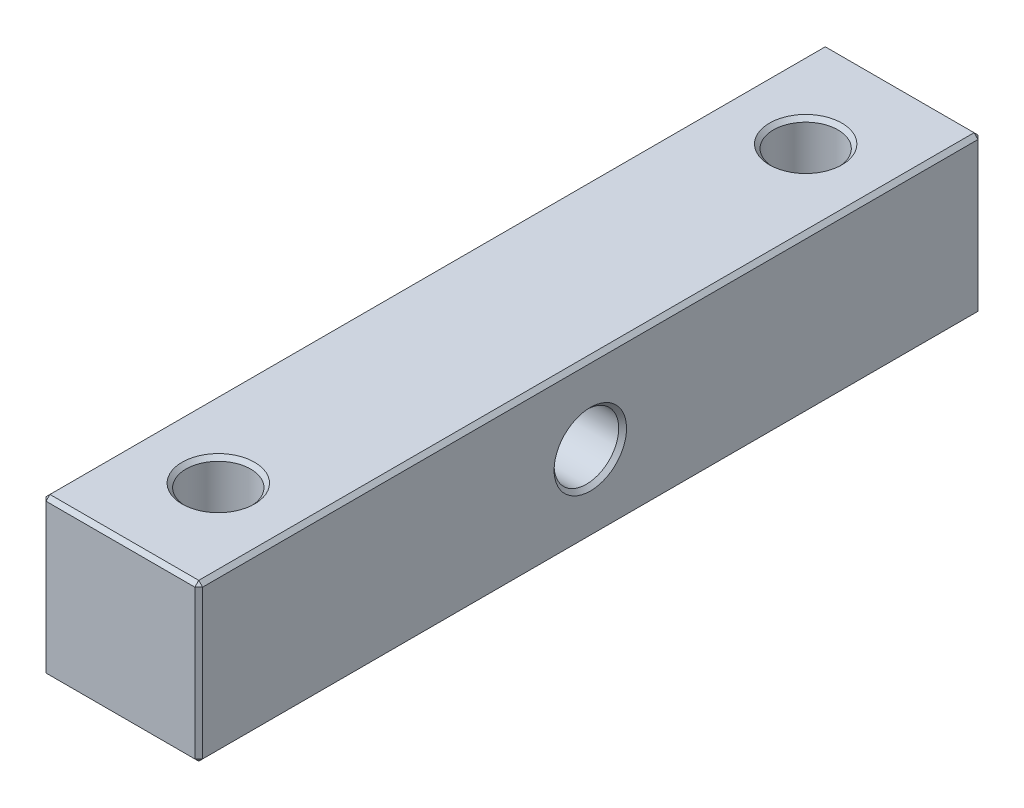
ISO-10303-21;
HEADER;
FILE_DESCRIPTION(('STEP AP214'),'2;1');
FILE_NAME('part.step','',(''),(''),'','','');
FILE_SCHEMA(('AUTOMOTIVE_DESIGN { 1 0 10303 214 1 1 1 1 }'));
ENDSEC;
DATA;
#1=APPLICATION_CONTEXT('core data for automotive mechanical design processes');
#2=APPLICATION_PROTOCOL_DEFINITION('international standard','automotive_design',2000,#1);
#3=PRODUCT_CONTEXT('',#1,'mechanical');
#4=PRODUCT('Part','Part','',(#3));
#5=PRODUCT_RELATED_PRODUCT_CATEGORY('part','',(#4));
#6=PRODUCT_DEFINITION_FORMATION('','',#4);
#7=PRODUCT_DEFINITION_CONTEXT('part definition',#1,'design');
#8=PRODUCT_DEFINITION('design','',#6,#7);
#9=PRODUCT_DEFINITION_SHAPE('','',#8);
#10=(LENGTH_UNIT() NAMED_UNIT(*) SI_UNIT(.MILLI.,.METRE.));
#11=(NAMED_UNIT(*) PLANE_ANGLE_UNIT() SI_UNIT($,.RADIAN.));
#12=(NAMED_UNIT(*) SI_UNIT($,.STERADIAN.) SOLID_ANGLE_UNIT());
#13=UNCERTAINTY_MEASURE_WITH_UNIT(LENGTH_MEASURE(1.E-05),#10,'distance_accuracy_value','');
#14=(GEOMETRIC_REPRESENTATION_CONTEXT(3) GLOBAL_UNCERTAINTY_ASSIGNED_CONTEXT((#13)) GLOBAL_UNIT_ASSIGNED_CONTEXT((#10,
#11,#12)) REPRESENTATION_CONTEXT('',''));
#15=CARTESIAN_POINT('',(0.,0.,0.));
#16=DIRECTION('',(0.,0.,1.));
#17=DIRECTION('',(1.,0.,0.));
#18=AXIS2_PLACEMENT_3D('',#15,#16,#17);
#19=CARTESIAN_POINT('',(4.,4.,20.));
#20=DIRECTION('',(-1.,0.,0.));
#21=DIRECTION('',(0.,-1.,0.));
#22=AXIS2_PLACEMENT_3D('',#19,#20,#21);
#23=PLANE('',#22);
#24=DIRECTION('',(0.,-1.,0.));
#25=VECTOR('',#24,1.);
#26=CARTESIAN_POINT('',(4.,-4.,19.8));
#27=LINE('',#26,#25);
#28=CARTESIAN_POINT('',(4.,3.80000000000001,19.8));
#29=VERTEX_POINT('',#28);
#30=CARTESIAN_POINT('',(4.,-3.8,19.8));
#31=VERTEX_POINT('',#30);
#32=EDGE_CURVE('E51',#29,#31,#27,.T.);
#33=ORIENTED_EDGE('',*,*,#32,.T.);
#34=DIRECTION('',(0.,0.,-1.));
#35=VECTOR('',#34,1.);
#36=CARTESIAN_POINT('',(4.,-3.8,20.));
#37=LINE('',#36,#35);
#38=CARTESIAN_POINT('',(4.,-3.8,-19.8));
#39=VERTEX_POINT('',#38);
#40=EDGE_CURVE('E11',#31,#39,#37,.T.);
#41=ORIENTED_EDGE('',*,*,#40,.T.);
#42=DIRECTION('',(0.,1.,0.));
#43=VECTOR('',#42,1.);
#44=CARTESIAN_POINT('',(4.,4.,-19.8));
#45=LINE('',#44,#43);
#46=CARTESIAN_POINT('',(4.,3.80000000000001,-19.8));
#47=VERTEX_POINT('',#46);
#48=EDGE_CURVE('E244',#39,#47,#45,.T.);
#49=ORIENTED_EDGE('',*,*,#48,.T.);
#50=DIRECTION('',(0.,0.,1.));
#51=VECTOR('',#50,1.);
#52=CARTESIAN_POINT('',(4.,3.80000000000001,20.));
#53=LINE('',#52,#51);
#54=EDGE_CURVE('E62',#47,#29,#53,.T.);
#55=ORIENTED_EDGE('',*,*,#54,.T.);
#56=EDGE_LOOP('',(#33,#41,#49,#55));
#57=FACE_BOUND('',#56,.T.);
#58=CARTESIAN_POINT('',(4.,0.,0.));
#59=DIRECTION('',(-1.,0.,0.));
#60=DIRECTION('',(0.,-1.,0.));
#61=AXIS2_PLACEMENT_3D('',#58,#59,#60);
#62=CIRCLE('',#61,1.85);
#63=CARTESIAN_POINT('',(4.,-1.85,0.));
#64=VERTEX_POINT('',#63);
#65=EDGE_CURVE('E241',#64,#64,#62,.T.);
#66=ORIENTED_EDGE('',*,*,#65,.T.);
#67=EDGE_LOOP('',(#66));
#68=FACE_BOUND('',#67,.T.);
#69=ADVANCED_FACE('F41',(#57,#68),#23,.F.);
#70=CARTESIAN_POINT('',(-4.,4.,20.));
#71=DIRECTION('',(0.,-1.,0.));
#72=DIRECTION('',(0.,0.,-1.));
#73=AXIS2_PLACEMENT_3D('',#70,#71,#72);
#74=PLANE('',#73);
#75=CARTESIAN_POINT('',(0.,4.,-15.));
#76=DIRECTION('',(0.,-1.,0.));
#77=DIRECTION('',(0.,0.,-1.));
#78=AXIS2_PLACEMENT_3D('',#75,#76,#77);
#79=CIRCLE('',#78,1.85);
#80=CARTESIAN_POINT('',(0.,4.,-13.15));
#81=VERTEX_POINT('',#80);
#82=EDGE_CURVE('E222',#81,#81,#79,.T.);
#83=ORIENTED_EDGE('',*,*,#82,.T.);
#84=EDGE_LOOP('',(#83));
#85=FACE_BOUND('',#84,.T.);
#86=CARTESIAN_POINT('',(0.,4.,15.));
#87=DIRECTION('',(0.,-1.,0.));
#88=DIRECTION('',(0.,0.,-1.));
#89=AXIS2_PLACEMENT_3D('',#86,#87,#88);
#90=CIRCLE('',#89,1.85);
#91=CARTESIAN_POINT('',(0.,4.,16.85));
#92=VERTEX_POINT('',#91);
#93=EDGE_CURVE('E219',#92,#92,#90,.T.);
#94=ORIENTED_EDGE('',*,*,#93,.T.);
#95=EDGE_LOOP('',(#94));
#96=FACE_BOUND('',#95,.T.);
#97=DIRECTION('',(0.,0.,1.));
#98=VECTOR('',#97,1.);
#99=CARTESIAN_POINT('',(-3.80000000000001,4.,20.));
#100=LINE('',#99,#98);
#101=CARTESIAN_POINT('',(-3.80000000000001,4.,-19.8));
#102=VERTEX_POINT('',#101);
#103=CARTESIAN_POINT('',(-3.80000000000001,4.,19.8));
#104=VERTEX_POINT('',#103);
#105=EDGE_CURVE('E214',#102,#104,#100,.T.);
#106=ORIENTED_EDGE('',*,*,#105,.T.);
#107=DIRECTION('',(1.,0.,0.));
#108=VECTOR('',#107,1.);
#109=CARTESIAN_POINT('',(4.,4.,19.8));
#110=LINE('',#109,#108);
#111=CARTESIAN_POINT('',(3.8,4.,19.8));
#112=VERTEX_POINT('',#111);
#113=EDGE_CURVE('E216',#104,#112,#110,.T.);
#114=ORIENTED_EDGE('',*,*,#113,.T.);
#115=DIRECTION('',(0.,0.,-1.));
#116=VECTOR('',#115,1.);
#117=CARTESIAN_POINT('',(3.8,4.,20.));
#118=LINE('',#117,#116);
#119=CARTESIAN_POINT('',(3.8,4.,-19.8));
#120=VERTEX_POINT('',#119);
#121=EDGE_CURVE('E210',#112,#120,#118,.T.);
#122=ORIENTED_EDGE('',*,*,#121,.T.);
#123=DIRECTION('',(-1.,0.,0.));
#124=VECTOR('',#123,1.);
#125=CARTESIAN_POINT('',(-4.,4.,-19.8));
#126=LINE('',#125,#124);
#127=EDGE_CURVE('E212',#120,#102,#126,.T.);
#128=ORIENTED_EDGE('',*,*,#127,.T.);
#129=EDGE_LOOP('',(#106,#114,#122,#128));
#130=FACE_BOUND('',#129,.T.);
#131=ADVANCED_FACE('F344',(#85,#96,#130),#74,.F.);
#132=CARTESIAN_POINT('',(-4.,4.,20.));
#133=DIRECTION('',(1.,0.,0.));
#134=DIRECTION('',(0.,1.,0.));
#135=AXIS2_PLACEMENT_3D('',#132,#133,#134);
#136=PLANE('',#135);
#137=CARTESIAN_POINT('',(-4.,0.,0.));
#138=DIRECTION('',(1.,0.,0.));
#139=DIRECTION('',(0.,1.,0.));
#140=AXIS2_PLACEMENT_3D('',#137,#138,#139);
#141=CIRCLE('',#140,1.84999999999999);
#142=CARTESIAN_POINT('',(-4.,0.,1.84999999999999));
#143=VERTEX_POINT('',#142);
#144=EDGE_CURVE('E201',#143,#143,#141,.T.);
#145=ORIENTED_EDGE('',*,*,#144,.T.);
#146=EDGE_LOOP('',(#145));
#147=FACE_BOUND('',#146,.T.);
#148=DIRECTION('',(0.,0.,1.));
#149=VECTOR('',#148,1.);
#150=CARTESIAN_POINT('',(-4.,-3.8,20.));
#151=LINE('',#150,#149);
#152=CARTESIAN_POINT('',(-4.,-3.8,-19.8));
#153=VERTEX_POINT('',#152);
#154=CARTESIAN_POINT('',(-4.,-3.8,19.8));
#155=VERTEX_POINT('',#154);
#156=EDGE_CURVE('E196',#153,#155,#151,.T.);
#157=ORIENTED_EDGE('',*,*,#156,.T.);
#158=DIRECTION('',(0.,1.,0.));
#159=VECTOR('',#158,1.);
#160=CARTESIAN_POINT('',(-4.,4.,19.8));
#161=LINE('',#160,#159);
#162=CARTESIAN_POINT('',(-4.,3.80000000000001,19.8));
#163=VERTEX_POINT('',#162);
#164=EDGE_CURVE('E198',#155,#163,#161,.T.);
#165=ORIENTED_EDGE('',*,*,#164,.T.);
#166=DIRECTION('',(0.,0.,-1.));
#167=VECTOR('',#166,1.);
#168=CARTESIAN_POINT('',(-4.,3.80000000000001,20.));
#169=LINE('',#168,#167);
#170=CARTESIAN_POINT('',(-4.,3.80000000000001,-19.8));
#171=VERTEX_POINT('',#170);
#172=EDGE_CURVE('E192',#163,#171,#169,.T.);
#173=ORIENTED_EDGE('',*,*,#172,.T.);
#174=DIRECTION('',(0.,-1.,0.));
#175=VECTOR('',#174,1.);
#176=CARTESIAN_POINT('',(-4.,4.,-19.8));
#177=LINE('',#176,#175);
#178=EDGE_CURVE('E194',#171,#153,#177,.T.);
#179=ORIENTED_EDGE('',*,*,#178,.T.);
#180=EDGE_LOOP('',(#157,#165,#173,#179));
#181=FACE_BOUND('',#180,.T.);
#182=ADVANCED_FACE('F373',(#147,#181),#136,.F.);
#183=CARTESIAN_POINT('',(-4.,-4.,20.));
#184=DIRECTION('',(0.,1.,0.));
#185=DIRECTION('',(0.,0.,1.));
#186=AXIS2_PLACEMENT_3D('',#183,#184,#185);
#187=PLANE('',#186);
#188=CARTESIAN_POINT('',(0.,-4.,-15.));
#189=DIRECTION('',(0.,1.,0.));
#190=DIRECTION('',(0.,0.,1.));
#191=AXIS2_PLACEMENT_3D('',#188,#189,#190);
#192=CIRCLE('',#191,1.85);
#193=CARTESIAN_POINT('',(0.,-4.,-13.15));
#194=VERTEX_POINT('',#193);
#195=EDGE_CURVE('E177',#194,#194,#192,.T.);
#196=ORIENTED_EDGE('',*,*,#195,.T.);
#197=EDGE_LOOP('',(#196));
#198=FACE_BOUND('',#197,.T.);
#199=CARTESIAN_POINT('',(0.,-4.,15.));
#200=DIRECTION('',(0.,1.,0.));
#201=DIRECTION('',(0.,0.,1.));
#202=AXIS2_PLACEMENT_3D('',#199,#200,#201);
#203=CIRCLE('',#202,1.85);
#204=CARTESIAN_POINT('',(0.,-4.,16.85));
#205=VERTEX_POINT('',#204);
#206=EDGE_CURVE('E174',#205,#205,#203,.T.);
#207=ORIENTED_EDGE('',*,*,#206,.T.);
#208=EDGE_LOOP('',(#207));
#209=FACE_BOUND('',#208,.T.);
#210=DIRECTION('',(-1.,0.,0.));
#211=VECTOR('',#210,1.);
#212=CARTESIAN_POINT('',(-4.,-4.,19.8));
#213=LINE('',#212,#211);
#214=CARTESIAN_POINT('',(3.8,-4.,19.8));
#215=VERTEX_POINT('',#214);
#216=CARTESIAN_POINT('',(-3.8,-4.,19.8));
#217=VERTEX_POINT('',#216);
#218=EDGE_CURVE('E142',#215,#217,#213,.T.);
#219=ORIENTED_EDGE('',*,*,#218,.T.);
#220=DIRECTION('',(0.,0.,-1.));
#221=VECTOR('',#220,1.);
#222=CARTESIAN_POINT('',(-3.8,-4.,20.));
#223=LINE('',#222,#221);
#224=CARTESIAN_POINT('',(-3.8,-4.,-19.8));
#225=VERTEX_POINT('',#224);
#226=EDGE_CURVE('E138',#217,#225,#223,.T.);
#227=ORIENTED_EDGE('',*,*,#226,.T.);
#228=DIRECTION('',(1.,0.,0.));
#229=VECTOR('',#228,1.);
#230=CARTESIAN_POINT('',(-4.,-4.,-19.8));
#231=LINE('',#230,#229);
#232=CARTESIAN_POINT('',(3.8,-4.,-19.8));
#233=VERTEX_POINT('',#232);
#234=EDGE_CURVE('E130',#225,#233,#231,.T.);
#235=ORIENTED_EDGE('',*,*,#234,.T.);
#236=DIRECTION('',(0.,0.,1.));
#237=VECTOR('',#236,1.);
#238=CARTESIAN_POINT('',(3.8,-4.,20.));
#239=LINE('',#238,#237);
#240=EDGE_CURVE('E135',#233,#215,#239,.T.);
#241=ORIENTED_EDGE('',*,*,#240,.T.);
#242=EDGE_LOOP('',(#219,#227,#235,#241));
#243=FACE_BOUND('',#242,.T.);
#244=ADVANCED_FACE('F133',(#198,#209,#243),#187,.F.);
#245=CARTESIAN_POINT('',(0.,0.,20.));
#246=DIRECTION('',(0.,0.,1.));
#247=DIRECTION('',(1.,0.,0.));
#248=AXIS2_PLACEMENT_3D('',#245,#246,#247);
#249=PLANE('',#248);
#250=DIRECTION('',(0.,-1.,0.));
#251=VECTOR('',#250,1.);
#252=CARTESIAN_POINT('',(-3.8,-4.,20.));
#253=LINE('',#252,#251);
#254=CARTESIAN_POINT('',(-3.80000000000001,3.80000000000001,20.));
#255=VERTEX_POINT('',#254);
#256=CARTESIAN_POINT('',(-3.8,-3.8,20.));
#257=VERTEX_POINT('',#256);
#258=EDGE_CURVE('E229',#255,#257,#253,.T.);
#259=ORIENTED_EDGE('',*,*,#258,.T.);
#260=DIRECTION('',(1.,0.,0.));
#261=VECTOR('',#260,1.);
#262=CARTESIAN_POINT('',(4.,-3.8,20.));
#263=LINE('',#262,#261);
#264=CARTESIAN_POINT('',(3.8,-3.8,20.));
#265=VERTEX_POINT('',#264);
#266=EDGE_CURVE('E231',#257,#265,#263,.T.);
#267=ORIENTED_EDGE('',*,*,#266,.T.);
#268=DIRECTION('',(0.,1.,0.));
#269=VECTOR('',#268,1.);
#270=CARTESIAN_POINT('',(3.8,4.,20.));
#271=LINE('',#270,#269);
#272=CARTESIAN_POINT('',(3.8,3.80000000000001,20.));
#273=VERTEX_POINT('',#272);
#274=EDGE_CURVE('E225',#265,#273,#271,.T.);
#275=ORIENTED_EDGE('',*,*,#274,.T.);
#276=DIRECTION('',(-1.,0.,0.));
#277=VECTOR('',#276,1.);
#278=CARTESIAN_POINT('',(-4.,3.80000000000001,20.));
#279=LINE('',#278,#277);
#280=EDGE_CURVE('E227',#273,#255,#279,.T.);
#281=ORIENTED_EDGE('',*,*,#280,.T.);
#282=EDGE_LOOP('',(#259,#267,#275,#281));
#283=FACE_BOUND('',#282,.T.);
#284=ADVANCED_FACE('F364',(#283),#249,.T.);
#285=CARTESIAN_POINT('',(0.,0.,-20.));
#286=DIRECTION('',(0.,0.,1.));
#287=DIRECTION('',(1.,0.,0.));
#288=AXIS2_PLACEMENT_3D('',#285,#286,#287);
#289=PLANE('',#288);
#290=DIRECTION('',(0.,-1.,0.));
#291=VECTOR('',#290,1.);
#292=CARTESIAN_POINT('',(3.8,0.,-20.));
#293=LINE('',#292,#291);
#294=CARTESIAN_POINT('',(3.8,3.80000000000001,-20.));
#295=VERTEX_POINT('',#294);
#296=CARTESIAN_POINT('',(3.8,-3.8,-20.));
#297=VERTEX_POINT('',#296);
#298=EDGE_CURVE('E234',#295,#297,#293,.T.);
#299=ORIENTED_EDGE('',*,*,#298,.T.);
#300=DIRECTION('',(-1.,0.,0.));
#301=VECTOR('',#300,1.);
#302=CARTESIAN_POINT('',(0.,-3.8,-20.));
#303=LINE('',#302,#301);
#304=CARTESIAN_POINT('',(-3.8,-3.8,-20.));
#305=VERTEX_POINT('',#304);
#306=EDGE_CURVE('E150',#297,#305,#303,.T.);
#307=ORIENTED_EDGE('',*,*,#306,.T.);
#308=DIRECTION('',(0.,1.,0.));
#309=VECTOR('',#308,1.);
#310=CARTESIAN_POINT('',(-3.80000000000001,0.,-20.));
#311=LINE('',#310,#309);
#312=CARTESIAN_POINT('',(-3.80000000000001,3.80000000000001,-20.));
#313=VERTEX_POINT('',#312);
#314=EDGE_CURVE('E238',#305,#313,#311,.T.);
#315=ORIENTED_EDGE('',*,*,#314,.T.);
#316=DIRECTION('',(1.,0.,0.));
#317=VECTOR('',#316,1.);
#318=CARTESIAN_POINT('',(0.,3.80000000000001,-20.));
#319=LINE('',#318,#317);
#320=EDGE_CURVE('E236',#313,#295,#319,.T.);
#321=ORIENTED_EDGE('',*,*,#320,.T.);
#322=EDGE_LOOP('',(#299,#307,#315,#321));
#323=FACE_BOUND('',#322,.T.);
#324=ADVANCED_FACE('F339',(#323),#289,.F.);
#325=CARTESIAN_POINT('',(4.,0.,0.));
#326=DIRECTION('',(1.,0.,0.));
#327=DIRECTION('',(0.,0.,-1.));
#328=AXIS2_PLACEMENT_3D('',#325,#326,#327);
#329=CYLINDRICAL_SURFACE('',#328,1.65);
#330=CARTESIAN_POINT('',(-3.80000000000001,0.,0.));
#331=DIRECTION('',(1.,0.,0.));
#332=DIRECTION('',(0.,0.,-1.));
#333=AXIS2_PLACEMENT_3D('',#330,#331,#332);
#334=CIRCLE('',#333,1.65);
#335=CARTESIAN_POINT('',(-3.80000000000001,0.,1.65));
#336=VERTEX_POINT('',#335);
#337=EDGE_CURVE('E207',#336,#336,#334,.F.);
#338=ORIENTED_EDGE('',*,*,#337,.T.);
#339=EDGE_LOOP('',(#338));
#340=FACE_BOUND('',#339,.T.);
#341=CARTESIAN_POINT('',(3.8,0.,0.));
#342=DIRECTION('',(-1.,0.,0.));
#343=DIRECTION('',(0.,0.,1.));
#344=AXIS2_PLACEMENT_3D('',#341,#342,#343);
#345=CIRCLE('',#344,1.65);
#346=CARTESIAN_POINT('',(3.8,0.,1.65));
#347=VERTEX_POINT('',#346);
#348=EDGE_CURVE('E204',#347,#347,#345,.F.);
#349=ORIENTED_EDGE('',*,*,#348,.T.);
#350=EDGE_LOOP('',(#349));
#351=FACE_BOUND('',#350,.T.);
#352=ADVANCED_FACE('F352',(#340,#351),#329,.F.);
#353=CARTESIAN_POINT('',(0.,4.,-15.));
#354=DIRECTION('',(0.,1.,0.));
#355=DIRECTION('',(0.,0.,1.));
#356=AXIS2_PLACEMENT_3D('',#353,#354,#355);
#357=CYLINDRICAL_SURFACE('',#356,1.65);
#358=CARTESIAN_POINT('',(0.,-3.8,-15.));
#359=DIRECTION('',(0.,1.,0.));
#360=DIRECTION('',(0.,0.,1.));
#361=AXIS2_PLACEMENT_3D('',#358,#359,#360);
#362=CIRCLE('',#361,1.65);
#363=CARTESIAN_POINT('',(0.,-3.8,-13.35));
#364=VERTEX_POINT('',#363);
#365=EDGE_CURVE('E183',#364,#364,#362,.F.);
#366=ORIENTED_EDGE('',*,*,#365,.T.);
#367=EDGE_LOOP('',(#366));
#368=FACE_BOUND('',#367,.T.);
#369=CARTESIAN_POINT('',(0.,3.80000000000001,-15.));
#370=DIRECTION('',(0.,-1.,0.));
#371=DIRECTION('',(0.,0.,-1.));
#372=AXIS2_PLACEMENT_3D('',#369,#370,#371);
#373=CIRCLE('',#372,1.65);
#374=CARTESIAN_POINT('',(0.,3.80000000000001,-13.35));
#375=VERTEX_POINT('',#374);
#376=EDGE_CURVE('E180',#375,#375,#373,.F.);
#377=ORIENTED_EDGE('',*,*,#376,.T.);
#378=EDGE_LOOP('',(#377));
#379=FACE_BOUND('',#378,.T.);
#380=ADVANCED_FACE('F354',(#368,#379),#357,.F.);
#381=CARTESIAN_POINT('',(0.,4.,15.));
#382=DIRECTION('',(0.,1.,0.));
#383=DIRECTION('',(0.,0.,1.));
#384=AXIS2_PLACEMENT_3D('',#381,#382,#383);
#385=CYLINDRICAL_SURFACE('',#384,1.65);
#386=CARTESIAN_POINT('',(0.,-3.8,15.));
#387=DIRECTION('',(0.,1.,0.));
#388=DIRECTION('',(0.,0.,1.));
#389=AXIS2_PLACEMENT_3D('',#386,#387,#388);
#390=CIRCLE('',#389,1.65);
#391=CARTESIAN_POINT('',(0.,-3.8,16.65));
#392=VERTEX_POINT('',#391);
#393=EDGE_CURVE('E189',#392,#392,#390,.F.);
#394=ORIENTED_EDGE('',*,*,#393,.T.);
#395=EDGE_LOOP('',(#394));
#396=FACE_BOUND('',#395,.T.);
#397=CARTESIAN_POINT('',(0.,3.80000000000001,15.));
#398=DIRECTION('',(0.,-1.,0.));
#399=DIRECTION('',(0.,0.,-1.));
#400=AXIS2_PLACEMENT_3D('',#397,#398,#399);
#401=CIRCLE('',#400,1.65);
#402=CARTESIAN_POINT('',(0.,3.80000000000001,16.65));
#403=VERTEX_POINT('',#402);
#404=EDGE_CURVE('E186',#403,#403,#401,.F.);
#405=ORIENTED_EDGE('',*,*,#404,.T.);
#406=EDGE_LOOP('',(#405));
#407=FACE_BOUND('',#406,.T.);
#408=ADVANCED_FACE('F361',(#396,#407),#385,.F.);
#409=CARTESIAN_POINT('',(0.,-4.,-15.));
#410=DIRECTION('',(0.,-1.,0.));
#411=DIRECTION('',(0.,0.,-1.));
#412=AXIS2_PLACEMENT_3D('',#409,#410,#411);
#413=CONICAL_SURFACE('',#412,1.85,0.785398163397461);
#414=ORIENTED_EDGE('',*,*,#365,.F.);
#415=EDGE_LOOP('',(#414));
#416=FACE_BOUND('',#415,.T.);
#417=ORIENTED_EDGE('',*,*,#195,.F.);
#418=EDGE_LOOP('',(#417));
#419=FACE_BOUND('',#418,.T.);
#420=ADVANCED_FACE('F382',(#416,#419),#413,.F.);
#421=CARTESIAN_POINT('',(0.,-4.,15.));
#422=DIRECTION('',(0.,-1.,0.));
#423=DIRECTION('',(0.,0.,-1.));
#424=AXIS2_PLACEMENT_3D('',#421,#422,#423);
#425=CONICAL_SURFACE('',#424,1.85,0.785398163397461);
#426=ORIENTED_EDGE('',*,*,#393,.F.);
#427=EDGE_LOOP('',(#426));
#428=FACE_BOUND('',#427,.T.);
#429=ORIENTED_EDGE('',*,*,#206,.F.);
#430=EDGE_LOOP('',(#429));
#431=FACE_BOUND('',#430,.T.);
#432=ADVANCED_FACE('F388',(#428,#431),#425,.F.);
#433=CARTESIAN_POINT('',(-4.,0.,0.));
#434=DIRECTION('',(-1.,0.,0.));
#435=DIRECTION('',(0.,0.,1.));
#436=AXIS2_PLACEMENT_3D('',#433,#434,#435);
#437=CONICAL_SURFACE('',#436,1.84999999999999,0.78539816339745);
#438=CARTESIAN_POINT('',(-3.80000000000001,0.,1.65));
#439=CARTESIAN_POINT('',(-3.80208333333334,0.,1.65208333333333));
#440=CARTESIAN_POINT('',(-3.80416666666667,0.,1.65416666666667));
#441=CARTESIAN_POINT('',(-3.80833333333334,0.,1.65833333333333));
#442=CARTESIAN_POINT('',(-3.81041666666667,0.,1.66041666666667));
#443=CARTESIAN_POINT('',(-3.81458333333334,0.,1.66458333333333));
#444=CARTESIAN_POINT('',(-3.81666666666667,0.,1.66666666666666));
#445=CARTESIAN_POINT('',(-3.82083333333334,0.,1.67083333333333));
#446=CARTESIAN_POINT('',(-3.82291666666667,0.,1.67291666666667));
#447=CARTESIAN_POINT('',(-3.82708333333334,0.,1.67708333333333));
#448=CARTESIAN_POINT('',(-3.82916666666667,0.,1.67916666666666));
#449=CARTESIAN_POINT('',(-3.83333333333334,0.,1.68333333333333));
#450=CARTESIAN_POINT('',(-3.83541666666667,0.,1.68541666666666));
#451=CARTESIAN_POINT('',(-3.83958333333334,0.,1.68958333333333));
#452=CARTESIAN_POINT('',(-3.84166666666667,0.,1.69166666666666));
#453=CARTESIAN_POINT('',(-3.84583333333334,0.,1.69583333333333));
#454=CARTESIAN_POINT('',(-3.84791666666667,0.,1.69791666666666));
#455=CARTESIAN_POINT('',(-3.85208333333334,0.,1.70208333333333));
#456=CARTESIAN_POINT('',(-3.85416666666667,0.,1.70416666666666));
#457=CARTESIAN_POINT('',(-3.85833333333334,0.,1.70833333333333));
#458=CARTESIAN_POINT('',(-3.86041666666667,0.,1.71041666666666));
#459=CARTESIAN_POINT('',(-3.86458333333334,0.,1.71458333333333));
#460=CARTESIAN_POINT('',(-3.86666666666667,0.,1.71666666666666));
#461=CARTESIAN_POINT('',(-3.87083333333334,0.,1.72083333333333));
#462=CARTESIAN_POINT('',(-3.87291666666667,0.,1.72291666666666));
#463=CARTESIAN_POINT('',(-3.87708333333334,0.,1.72708333333333));
#464=CARTESIAN_POINT('',(-3.87916666666667,0.,1.72916666666666));
#465=CARTESIAN_POINT('',(-3.88333333333334,0.,1.73333333333333));
#466=CARTESIAN_POINT('',(-3.88541666666667,0.,1.73541666666666));
#467=CARTESIAN_POINT('',(-3.88958333333334,0.,1.73958333333333));
#468=CARTESIAN_POINT('',(-3.89166666666667,0.,1.74166666666666));
#469=CARTESIAN_POINT('',(-3.89583333333334,0.,1.74583333333333));
#470=CARTESIAN_POINT('',(-3.89791666666667,0.,1.74791666666666));
#471=CARTESIAN_POINT('',(-3.90208333333334,0.,1.75208333333333));
#472=CARTESIAN_POINT('',(-3.90416666666667,0.,1.75416666666666));
#473=CARTESIAN_POINT('',(-3.90833333333334,0.,1.75833333333333));
#474=CARTESIAN_POINT('',(-3.91041666666667,0.,1.76041666666666));
#475=CARTESIAN_POINT('',(-3.91458333333334,0.,1.76458333333333));
#476=CARTESIAN_POINT('',(-3.91666666666667,0.,1.76666666666666));
#477=CARTESIAN_POINT('',(-3.92083333333334,0.,1.77083333333333));
#478=CARTESIAN_POINT('',(-3.92291666666667,0.,1.77291666666666));
#479=CARTESIAN_POINT('',(-3.92708333333334,0.,1.77708333333333));
#480=CARTESIAN_POINT('',(-3.92916666666667,0.,1.77916666666666));
#481=CARTESIAN_POINT('',(-3.93333333333334,0.,1.78333333333333));
#482=CARTESIAN_POINT('',(-3.93541666666667,0.,1.78541666666666));
#483=CARTESIAN_POINT('',(-3.93958333333334,0.,1.78958333333333));
#484=CARTESIAN_POINT('',(-3.94166666666667,0.,1.79166666666666));
#485=CARTESIAN_POINT('',(-3.94583333333334,0.,1.79583333333333));
#486=CARTESIAN_POINT('',(-3.94791666666667,0.,1.79791666666666));
#487=CARTESIAN_POINT('',(-3.95208333333334,0.,1.80208333333333));
#488=CARTESIAN_POINT('',(-3.95416666666667,0.,1.80416666666666));
#489=CARTESIAN_POINT('',(-3.95833333333333,0.,1.80833333333333));
#490=CARTESIAN_POINT('',(-3.96041666666667,0.,1.81041666666666));
#491=CARTESIAN_POINT('',(-3.96458333333333,0.,1.81458333333333));
#492=CARTESIAN_POINT('',(-3.96666666666667,0.,1.81666666666666));
#493=CARTESIAN_POINT('',(-3.97083333333333,0.,1.82083333333333));
#494=CARTESIAN_POINT('',(-3.97291666666667,0.,1.82291666666666));
#495=CARTESIAN_POINT('',(-3.97708333333333,0.,1.82708333333333));
#496=CARTESIAN_POINT('',(-3.97916666666667,0.,1.82916666666666));
#497=CARTESIAN_POINT('',(-3.98333333333333,0.,1.83333333333333));
#498=CARTESIAN_POINT('',(-3.98541666666667,0.,1.83541666666666));
#499=CARTESIAN_POINT('',(-3.98958333333333,0.,1.83958333333333));
#500=CARTESIAN_POINT('',(-3.99166666666667,0.,1.84166666666666));
#501=CARTESIAN_POINT('',(-3.99583333333333,0.,1.84583333333333));
#502=CARTESIAN_POINT('',(-3.99791666666667,0.,1.84791666666666));
#503=CARTESIAN_POINT('',(-4.,0.,1.84999999999999));
#504=B_SPLINE_CURVE_WITH_KNOTS('',3,(#438,#439,#440,#441,#442,#443,#444,#445,#446,#447,#448,
#449,#450,#451,#452,#453,#454,#455,#456,#457,#458,#459,#460,#461,#462,#463,#464,#465,#466,#467,
#468,#469,#470,#471,#472,#473,#474,#475,#476,#477,#478,#479,#480,#481,#482,#483,#484,#485,#486,
#487,#488,#489,#490,#491,#492,#493,#494,#495,#496,#497,#498,#499,#500,#501,#502,#503),
.UNSPECIFIED.,.F.,.F.,(4,2,2,2,2,2,2,2,2,2,2,2,2,2,2,2,2,2,2,2,2,2,2,2,2,2,2,2,2,2,2,2,4),(0.,
0.00883883476483148,0.0176776695296631,0.0265165042944946,0.0353553390593262,0.0441941738241582,
0.0530330085889897,0.0618718433538213,0.0707106781186528,0.0795495128834844,0.0883883476483162,
0.0972271824131479,0.106066017177979,0.114904851942811,0.123743686707642,0.132582521472474,
0.141421356237306,0.150260191002137,0.159099025766969,0.167937860531801,0.176776695296632,
0.185615530061464,0.194454364826296,0.203293199591127,0.212132034355959,0.22097086912079,
0.229809703885622,0.238648538650454,0.247487373415285,0.256326208180117,0.265165042944949,
0.27400387770978,0.282842712474612),.UNSPECIFIED.);
#505=EDGE_CURVE('BSEAM395',#336,#143,#504,.T.);
#506=ORIENTED_EDGE('',*,*,#337,.F.);
#507=ORIENTED_EDGE('',*,*,#144,.F.);
#508=ORIENTED_EDGE('',*,*,#505,.T.);
#509=ORIENTED_EDGE('',*,*,#505,.F.);
#510=EDGE_LOOP('',(#506,#508,#507,#509));
#511=FACE_BOUND('',#510,.T.);
#512=ADVANCED_FACE('F395',(#511),#437,.F.);
#513=CARTESIAN_POINT('',(0.,3.80000000000001,-15.));
#514=DIRECTION('',(0.,1.,0.));
#515=DIRECTION('',(0.,0.,1.));
#516=AXIS2_PLACEMENT_3D('',#513,#514,#515);
#517=CONICAL_SURFACE('',#516,1.65,0.785398163397461);
#518=CARTESIAN_POINT('',(0.,4.,-13.15));
#519=CARTESIAN_POINT('',(0.,3.99791666666667,-13.1520833333333));
#520=CARTESIAN_POINT('',(0.,3.99583333333333,-13.1541666666667));
#521=CARTESIAN_POINT('',(0.,3.99166666666667,-13.1583333333333));
#522=CARTESIAN_POINT('',(0.,3.98958333333333,-13.1604166666667));
#523=CARTESIAN_POINT('',(0.,3.98541666666667,-13.1645833333333));
#524=CARTESIAN_POINT('',(0.,3.98333333333334,-13.1666666666667));
#525=CARTESIAN_POINT('',(0.,3.97916666666667,-13.1708333333333));
#526=CARTESIAN_POINT('',(0.,3.97708333333334,-13.1729166666667));
#527=CARTESIAN_POINT('',(0.,3.97291666666667,-13.1770833333333));
#528=CARTESIAN_POINT('',(0.,3.97083333333334,-13.1791666666667));
#529=CARTESIAN_POINT('',(0.,3.96666666666667,-13.1833333333333));
#530=CARTESIAN_POINT('',(0.,3.96458333333334,-13.1854166666667));
#531=CARTESIAN_POINT('',(0.,3.96041666666667,-13.1895833333333));
#532=CARTESIAN_POINT('',(0.,3.95833333333334,-13.1916666666667));
#533=CARTESIAN_POINT('',(0.,3.95416666666667,-13.1958333333333));
#534=CARTESIAN_POINT('',(0.,3.95208333333334,-13.1979166666667));
#535=CARTESIAN_POINT('',(0.,3.94791666666667,-13.2020833333333));
#536=CARTESIAN_POINT('',(0.,3.94583333333334,-13.2041666666667));
#537=CARTESIAN_POINT('',(0.,3.94166666666667,-13.2083333333333));
#538=CARTESIAN_POINT('',(0.,3.93958333333334,-13.2104166666667));
#539=CARTESIAN_POINT('',(0.,3.93541666666667,-13.2145833333333));
#540=CARTESIAN_POINT('',(0.,3.93333333333334,-13.2166666666667));
#541=CARTESIAN_POINT('',(0.,3.92916666666667,-13.2208333333333));
#542=CARTESIAN_POINT('',(0.,3.92708333333334,-13.2229166666667));
#543=CARTESIAN_POINT('',(0.,3.92291666666667,-13.2270833333333));
#544=CARTESIAN_POINT('',(0.,3.92083333333334,-13.2291666666667));
#545=CARTESIAN_POINT('',(0.,3.91666666666667,-13.2333333333333));
#546=CARTESIAN_POINT('',(0.,3.91458333333334,-13.2354166666667));
#547=CARTESIAN_POINT('',(0.,3.91041666666667,-13.2395833333333));
#548=CARTESIAN_POINT('',(0.,3.90833333333334,-13.2416666666667));
#549=CARTESIAN_POINT('',(0.,3.90416666666667,-13.2458333333333));
#550=CARTESIAN_POINT('',(0.,3.90208333333334,-13.2479166666667));
#551=CARTESIAN_POINT('',(0.,3.89791666666667,-13.2520833333333));
#552=CARTESIAN_POINT('',(0.,3.89583333333334,-13.2541666666667));
#553=CARTESIAN_POINT('',(0.,3.89166666666667,-13.2583333333333));
#554=CARTESIAN_POINT('',(0.,3.88958333333334,-13.2604166666667));
#555=CARTESIAN_POINT('',(0.,3.88541666666667,-13.2645833333333));
#556=CARTESIAN_POINT('',(0.,3.88333333333334,-13.2666666666667));
#557=CARTESIAN_POINT('',(0.,3.87916666666667,-13.2708333333333));
#558=CARTESIAN_POINT('',(0.,3.87708333333334,-13.2729166666667));
#559=CARTESIAN_POINT('',(0.,3.87291666666667,-13.2770833333333));
#560=CARTESIAN_POINT('',(0.,3.87083333333334,-13.2791666666667));
#561=CARTESIAN_POINT('',(0.,3.86666666666667,-13.2833333333333));
#562=CARTESIAN_POINT('',(0.,3.86458333333334,-13.2854166666667));
#563=CARTESIAN_POINT('',(0.,3.86041666666667,-13.2895833333333));
#564=CARTESIAN_POINT('',(0.,3.85833333333334,-13.2916666666667));
#565=CARTESIAN_POINT('',(0.,3.85416666666667,-13.2958333333333));
#566=CARTESIAN_POINT('',(0.,3.85208333333334,-13.2979166666667));
#567=CARTESIAN_POINT('',(0.,3.84791666666667,-13.3020833333333));
#568=CARTESIAN_POINT('',(0.,3.84583333333334,-13.3041666666667));
#569=CARTESIAN_POINT('',(0.,3.84166666666667,-13.3083333333333));
#570=CARTESIAN_POINT('',(0.,3.83958333333334,-13.3104166666667));
#571=CARTESIAN_POINT('',(0.,3.83541666666667,-13.3145833333333));
#572=CARTESIAN_POINT('',(0.,3.83333333333334,-13.3166666666667));
#573=CARTESIAN_POINT('',(0.,3.82916666666667,-13.3208333333333));
#574=CARTESIAN_POINT('',(0.,3.82708333333334,-13.3229166666667));
#575=CARTESIAN_POINT('',(0.,3.82291666666667,-13.3270833333333));
#576=CARTESIAN_POINT('',(0.,3.82083333333334,-13.3291666666667));
#577=CARTESIAN_POINT('',(0.,3.81666666666667,-13.3333333333333));
#578=CARTESIAN_POINT('',(0.,3.81458333333334,-13.3354166666667));
#579=CARTESIAN_POINT('',(0.,3.81041666666667,-13.3395833333333));
#580=CARTESIAN_POINT('',(0.,3.80833333333334,-13.3416666666667));
#581=CARTESIAN_POINT('',(0.,3.80416666666667,-13.3458333333333));
#582=CARTESIAN_POINT('',(0.,3.80208333333334,-13.3479166666667));
#583=CARTESIAN_POINT('',(0.,3.80000000000001,-13.35));
#584=B_SPLINE_CURVE_WITH_KNOTS('',3,(#518,#519,#520,#521,#522,#523,#524,#525,#526,#527,#528,
#529,#530,#531,#532,#533,#534,#535,#536,#537,#538,#539,#540,#541,#542,#543,#544,#545,#546,#547,
#548,#549,#550,#551,#552,#553,#554,#555,#556,#557,#558,#559,#560,#561,#562,#563,#564,#565,#566,
#567,#568,#569,#570,#571,#572,#573,#574,#575,#576,#577,#578,#579,#580,#581,#582,#583),
.UNSPECIFIED.,.F.,.F.,(4,2,2,2,2,2,2,2,2,2,2,2,2,2,2,2,2,2,2,2,2,2,2,2,2,2,2,2,2,2,2,2,4),(0.,
0.00883883476483087,0.0176776695296624,0.0265165042944944,0.0353553390593259,0.044194173824158,
0.0530330085889895,0.061871843353821,0.0707106781186531,0.0795495128834846,0.0883883476483167,
0.0972271824131482,0.106066017177979,0.114904851942812,0.123743686707643,0.132582521472475,
0.141421356237307,0.150260191002138,0.15909902576697,0.167937860531802,0.176776695296633,
0.185615530061465,0.194454364826296,0.203293199591128,0.21213203435596,0.220970869120791,
0.229809703885624,0.238648538650455,0.247487373415286,0.256326208180119,0.26516504294495,
0.274003877709782,0.282842712474614),.UNSPECIFIED.);
#585=EDGE_CURVE('BSEAM402',#81,#375,#584,.T.);
#586=ORIENTED_EDGE('',*,*,#82,.F.);
#587=ORIENTED_EDGE('',*,*,#376,.F.);
#588=ORIENTED_EDGE('',*,*,#585,.T.);
#589=ORIENTED_EDGE('',*,*,#585,.F.);
#590=EDGE_LOOP('',(#586,#588,#587,#589));
#591=FACE_BOUND('',#590,.T.);
#592=ADVANCED_FACE('F402',(#591),#517,.F.);
#593=CARTESIAN_POINT('',(0.,3.80000000000001,15.));
#594=DIRECTION('',(0.,1.,0.));
#595=DIRECTION('',(0.,0.,1.));
#596=AXIS2_PLACEMENT_3D('',#593,#594,#595);
#597=CONICAL_SURFACE('',#596,1.65,0.785398163397461);
#598=CARTESIAN_POINT('',(0.,4.,16.85));
#599=CARTESIAN_POINT('',(0.,3.99791666666667,16.8479166666667));
#600=CARTESIAN_POINT('',(0.,3.99583333333333,16.8458333333333));
#601=CARTESIAN_POINT('',(0.,3.99166666666667,16.8416666666667));
#602=CARTESIAN_POINT('',(0.,3.98958333333333,16.8395833333333));
#603=CARTESIAN_POINT('',(0.,3.98541666666667,16.8354166666667));
#604=CARTESIAN_POINT('',(0.,3.98333333333334,16.8333333333333));
#605=CARTESIAN_POINT('',(0.,3.97916666666667,16.8291666666667));
#606=CARTESIAN_POINT('',(0.,3.97708333333334,16.8270833333333));
#607=CARTESIAN_POINT('',(0.,3.97291666666667,16.8229166666667));
#608=CARTESIAN_POINT('',(0.,3.97083333333334,16.8208333333333));
#609=CARTESIAN_POINT('',(0.,3.96666666666667,16.8166666666667));
#610=CARTESIAN_POINT('',(0.,3.96458333333334,16.8145833333333));
#611=CARTESIAN_POINT('',(0.,3.96041666666667,16.8104166666667));
#612=CARTESIAN_POINT('',(0.,3.95833333333334,16.8083333333333));
#613=CARTESIAN_POINT('',(0.,3.95416666666667,16.8041666666667));
#614=CARTESIAN_POINT('',(0.,3.95208333333334,16.8020833333333));
#615=CARTESIAN_POINT('',(0.,3.94791666666667,16.7979166666667));
#616=CARTESIAN_POINT('',(0.,3.94583333333334,16.7958333333333));
#617=CARTESIAN_POINT('',(0.,3.94166666666667,16.7916666666667));
#618=CARTESIAN_POINT('',(0.,3.93958333333334,16.7895833333333));
#619=CARTESIAN_POINT('',(0.,3.93541666666667,16.7854166666667));
#620=CARTESIAN_POINT('',(0.,3.93333333333334,16.7833333333333));
#621=CARTESIAN_POINT('',(0.,3.92916666666667,16.7791666666667));
#622=CARTESIAN_POINT('',(0.,3.92708333333334,16.7770833333333));
#623=CARTESIAN_POINT('',(0.,3.92291666666667,16.7729166666667));
#624=CARTESIAN_POINT('',(0.,3.92083333333334,16.7708333333333));
#625=CARTESIAN_POINT('',(0.,3.91666666666667,16.7666666666667));
#626=CARTESIAN_POINT('',(0.,3.91458333333334,16.7645833333333));
#627=CARTESIAN_POINT('',(0.,3.91041666666667,16.7604166666667));
#628=CARTESIAN_POINT('',(0.,3.90833333333334,16.7583333333333));
#629=CARTESIAN_POINT('',(0.,3.90416666666667,16.7541666666667));
#630=CARTESIAN_POINT('',(0.,3.90208333333334,16.7520833333333));
#631=CARTESIAN_POINT('',(0.,3.89791666666667,16.7479166666667));
#632=CARTESIAN_POINT('',(0.,3.89583333333334,16.7458333333333));
#633=CARTESIAN_POINT('',(0.,3.89166666666667,16.7416666666667));
#634=CARTESIAN_POINT('',(0.,3.88958333333334,16.7395833333333));
#635=CARTESIAN_POINT('',(0.,3.88541666666667,16.7354166666667));
#636=CARTESIAN_POINT('',(0.,3.88333333333334,16.7333333333333));
#637=CARTESIAN_POINT('',(0.,3.87916666666667,16.7291666666667));
#638=CARTESIAN_POINT('',(0.,3.87708333333334,16.7270833333333));
#639=CARTESIAN_POINT('',(0.,3.87291666666667,16.7229166666667));
#640=CARTESIAN_POINT('',(0.,3.87083333333334,16.7208333333333));
#641=CARTESIAN_POINT('',(0.,3.86666666666667,16.7166666666667));
#642=CARTESIAN_POINT('',(0.,3.86458333333334,16.7145833333333));
#643=CARTESIAN_POINT('',(0.,3.86041666666667,16.7104166666667));
#644=CARTESIAN_POINT('',(0.,3.85833333333334,16.7083333333333));
#645=CARTESIAN_POINT('',(0.,3.85416666666667,16.7041666666667));
#646=CARTESIAN_POINT('',(0.,3.85208333333334,16.7020833333333));
#647=CARTESIAN_POINT('',(0.,3.84791666666667,16.6979166666667));
#648=CARTESIAN_POINT('',(0.,3.84583333333334,16.6958333333333));
#649=CARTESIAN_POINT('',(0.,3.84166666666667,16.6916666666667));
#650=CARTESIAN_POINT('',(0.,3.83958333333334,16.6895833333333));
#651=CARTESIAN_POINT('',(0.,3.83541666666667,16.6854166666667));
#652=CARTESIAN_POINT('',(0.,3.83333333333334,16.6833333333333));
#653=CARTESIAN_POINT('',(0.,3.82916666666667,16.6791666666667));
#654=CARTESIAN_POINT('',(0.,3.82708333333334,16.6770833333333));
#655=CARTESIAN_POINT('',(0.,3.82291666666667,16.6729166666667));
#656=CARTESIAN_POINT('',(0.,3.82083333333334,16.6708333333333));
#657=CARTESIAN_POINT('',(0.,3.81666666666667,16.6666666666667));
#658=CARTESIAN_POINT('',(0.,3.81458333333334,16.6645833333333));
#659=CARTESIAN_POINT('',(0.,3.81041666666667,16.6604166666667));
#660=CARTESIAN_POINT('',(0.,3.80833333333334,16.6583333333333));
#661=CARTESIAN_POINT('',(0.,3.80416666666667,16.6541666666667));
#662=CARTESIAN_POINT('',(0.,3.80208333333334,16.6520833333333));
#663=CARTESIAN_POINT('',(0.,3.80000000000001,16.65));
#664=B_SPLINE_CURVE_WITH_KNOTS('',3,(#598,#599,#600,#601,#602,#603,#604,#605,#606,#607,#608,
#609,#610,#611,#612,#613,#614,#615,#616,#617,#618,#619,#620,#621,#622,#623,#624,#625,#626,#627,
#628,#629,#630,#631,#632,#633,#634,#635,#636,#637,#638,#639,#640,#641,#642,#643,#644,#645,#646,
#647,#648,#649,#650,#651,#652,#653,#654,#655,#656,#657,#658,#659,#660,#661,#662,#663),
.UNSPECIFIED.,.F.,.F.,(4,2,2,2,2,2,2,2,2,2,2,2,2,2,2,2,2,2,2,2,2,2,2,2,2,2,2,2,2,2,2,2,4),(0.,
0.00883883476483087,0.0176776695296624,0.0265165042944932,0.0353553390593272,0.044194173824158,
0.0530330085889895,0.061871843353821,0.0707106781186519,0.0795495128834858,0.0883883476483167,
0.0972271824131482,0.106066017177979,0.114904851942811,0.123743686707641,0.132582521472475,
0.141421356237307,0.150260191002138,0.159099025766969,0.167937860531803,0.176776695296634,
0.185615530061465,0.194454364826296,0.203293199591128,0.212132034355959,0.220970869120793,
0.229809703885624,0.238648538650455,0.247487373415286,0.256326208180117,0.265165042944951,
0.274003877709782,0.282842712474614),.UNSPECIFIED.);
#665=EDGE_CURVE('BSEAM409',#92,#403,#664,.T.);
#666=ORIENTED_EDGE('',*,*,#93,.F.);
#667=ORIENTED_EDGE('',*,*,#404,.F.);
#668=ORIENTED_EDGE('',*,*,#665,.T.);
#669=ORIENTED_EDGE('',*,*,#665,.F.);
#670=EDGE_LOOP('',(#666,#668,#667,#669));
#671=FACE_BOUND('',#670,.T.);
#672=ADVANCED_FACE('F409',(#671),#597,.F.);
#673=CARTESIAN_POINT('',(-4.,4.,-19.8));
#674=DIRECTION('',(0.,-0.707106781186554,0.707106781186541));
#675=DIRECTION('',(-1.,0.,0.));
#676=AXIS2_PLACEMENT_3D('',#673,#674,#675);
#677=PLANE('',#676);
#678=DIRECTION('',(0.,0.707106781186541,0.707106781186554));
#679=VECTOR('',#678,1.);
#680=CARTESIAN_POINT('',(-3.80000000000001,3.80000000000001,-20.));
#681=LINE('',#680,#679);
#682=EDGE_CURVE('E46',#102,#313,#681,.F.);
#683=ORIENTED_EDGE('',*,*,#682,.F.);
#684=ORIENTED_EDGE('',*,*,#127,.F.);
#685=DIRECTION('',(0.,-0.707106781186541,-0.707106781186554));
#686=VECTOR('',#685,1.);
#687=CARTESIAN_POINT('',(3.8,3.80000000000001,-20.));
#688=LINE('',#687,#686);
#689=EDGE_CURVE('E170',#295,#120,#688,.F.);
#690=ORIENTED_EDGE('',*,*,#689,.F.);
#691=ORIENTED_EDGE('',*,*,#320,.F.);
#692=EDGE_LOOP('',(#683,#684,#690,#691));
#693=FACE_BOUND('',#692,.T.);
#694=ADVANCED_FACE('F416',(#693),#677,.F.);
#695=CARTESIAN_POINT('',(-3.80000000000001,3.80000000000001,-20.));
#696=DIRECTION('',(-0.577350269189629,0.577350269189629,-0.577350269189619));
#697=DIRECTION('',(-0.707106781186548,-0.707106781186548,0.));
#698=AXIS2_PLACEMENT_3D('',#695,#696,#697);
#699=PLANE('',#698);
#700=DIRECTION('',(-0.707106781186547,-0.707106781186547,0.));
#701=VECTOR('',#700,1.);
#702=CARTESIAN_POINT('',(-3.9,3.9,-19.8));
#703=LINE('',#702,#701);
#704=EDGE_CURVE('E289',#102,#171,#703,.T.);
#705=ORIENTED_EDGE('',*,*,#704,.F.);
#706=ORIENTED_EDGE('',*,*,#682,.T.);
#707=DIRECTION('',(0.707106781186541,0.,-0.707106781186554));
#708=VECTOR('',#707,1.);
#709=CARTESIAN_POINT('',(-3.80000000000001,3.80000000000001,-20.));
#710=LINE('',#709,#708);
#711=EDGE_CURVE('E292',#171,#313,#710,.T.);
#712=ORIENTED_EDGE('',*,*,#711,.F.);
#713=EDGE_LOOP('',(#705,#706,#712));
#714=FACE_BOUND('',#713,.T.);
#715=ADVANCED_FACE('F517',(#714),#699,.T.);
#716=CARTESIAN_POINT('',(3.8,3.80000000000001,-20.));
#717=DIRECTION('',(0.577350269189629,0.577350269189629,-0.577350269189619));
#718=DIRECTION('',(-0.707106781186548,0.707106781186548,0.));
#719=AXIS2_PLACEMENT_3D('',#716,#717,#718);
#720=PLANE('',#719);
#721=DIRECTION('',(0.707106781186541,0.,0.707106781186554));
#722=VECTOR('',#721,1.);
#723=CARTESIAN_POINT('',(3.8,3.80000000000001,-20.));
#724=LINE('',#723,#722);
#725=EDGE_CURVE('E283',#295,#47,#724,.T.);
#726=ORIENTED_EDGE('',*,*,#725,.F.);
#727=ORIENTED_EDGE('',*,*,#689,.T.);
#728=DIRECTION('',(-0.707106781186547,0.707106781186547,0.));
#729=VECTOR('',#728,1.);
#730=CARTESIAN_POINT('',(3.9,3.9,-19.8));
#731=LINE('',#730,#729);
#732=EDGE_CURVE('E286',#47,#120,#731,.T.);
#733=ORIENTED_EDGE('',*,*,#732,.F.);
#734=EDGE_LOOP('',(#726,#727,#733));
#735=FACE_BOUND('',#734,.T.);
#736=ADVANCED_FACE('F299',(#735),#720,.T.);
#737=CARTESIAN_POINT('',(-4.,4.,-19.8));
#738=DIRECTION('',(0.707106781186554,0.,0.707106781186541));
#739=DIRECTION('',(0.,-1.,0.));
#740=AXIS2_PLACEMENT_3D('',#737,#738,#739);
#741=PLANE('',#740);
#742=ORIENTED_EDGE('',*,*,#711,.T.);
#743=ORIENTED_EDGE('',*,*,#314,.F.);
#744=DIRECTION('',(-0.707106781186541,0.,0.707106781186554));
#745=VECTOR('',#744,1.);
#746=CARTESIAN_POINT('',(-3.8,-3.8,-20.));
#747=LINE('',#746,#745);
#748=EDGE_CURVE('E279',#153,#305,#747,.F.);
#749=ORIENTED_EDGE('',*,*,#748,.F.);
#750=ORIENTED_EDGE('',*,*,#178,.F.);
#751=EDGE_LOOP('',(#742,#743,#749,#750));
#752=FACE_BOUND('',#751,.T.);
#753=ADVANCED_FACE('F335',(#752),#741,.F.);
#754=CARTESIAN_POINT('',(-4.,3.80000000000001,20.));
#755=DIRECTION('',(0.707106781186547,-0.707106781186547,0.));
#756=DIRECTION('',(0.,0.,-1.));
#757=AXIS2_PLACEMENT_3D('',#754,#755,#756);
#758=PLANE('',#757);
#759=ORIENTED_EDGE('',*,*,#704,.T.);
#760=ORIENTED_EDGE('',*,*,#172,.F.);
#761=DIRECTION('',(0.707106781186547,0.707106781186547,0.));
#762=VECTOR('',#761,1.);
#763=CARTESIAN_POINT('',(-4.,3.80000000000001,19.8));
#764=LINE('',#763,#762);
#765=EDGE_CURVE('E276',#104,#163,#764,.F.);
#766=ORIENTED_EDGE('',*,*,#765,.F.);
#767=ORIENTED_EDGE('',*,*,#105,.F.);
#768=EDGE_LOOP('',(#759,#760,#766,#767));
#769=FACE_BOUND('',#768,.T.);
#770=ADVANCED_FACE('F499',(#769),#758,.F.);
#771=CARTESIAN_POINT('',(0.,3.80000000000001,20.));
#772=DIRECTION('',(0.,0.707106781186547,0.707106781186547));
#773=DIRECTION('',(1.,0.,0.));
#774=AXIS2_PLACEMENT_3D('',#771,#772,#773);
#775=PLANE('',#774);
#776=DIRECTION('',(0.,-0.707106781186547,0.707106781186547));
#777=VECTOR('',#776,1.);
#778=CARTESIAN_POINT('',(3.8,4.,19.8));
#779=LINE('',#778,#777);
#780=EDGE_CURVE('E270',#112,#273,#779,.T.);
#781=ORIENTED_EDGE('',*,*,#780,.F.);
#782=ORIENTED_EDGE('',*,*,#113,.F.);
#783=DIRECTION('',(0.,0.707106781186547,-0.707106781186547));
#784=VECTOR('',#783,1.);
#785=CARTESIAN_POINT('',(-3.80000000000001,3.9,19.9));
#786=LINE('',#785,#784);
#787=EDGE_CURVE('E273',#255,#104,#786,.T.);
#788=ORIENTED_EDGE('',*,*,#787,.F.);
#789=ORIENTED_EDGE('',*,*,#280,.F.);
#790=EDGE_LOOP('',(#781,#782,#788,#789));
#791=FACE_BOUND('',#790,.T.);
#792=ADVANCED_FACE('F493',(#791),#775,.T.);
#793=CARTESIAN_POINT('',(3.8,4.,20.));
#794=DIRECTION('',(-0.707106781186547,-0.707106781186547,0.));
#795=DIRECTION('',(0.,0.,-1.));
#796=AXIS2_PLACEMENT_3D('',#793,#794,#795);
#797=PLANE('',#796);
#798=ORIENTED_EDGE('',*,*,#732,.T.);
#799=ORIENTED_EDGE('',*,*,#121,.F.);
#800=DIRECTION('',(0.707106781186547,-0.707106781186547,0.));
#801=VECTOR('',#800,1.);
#802=CARTESIAN_POINT('',(3.8,4.,19.8));
#803=LINE('',#802,#801);
#804=EDGE_CURVE('E268',#29,#112,#803,.F.);
#805=ORIENTED_EDGE('',*,*,#804,.F.);
#806=ORIENTED_EDGE('',*,*,#54,.F.);
#807=EDGE_LOOP('',(#798,#799,#805,#806));
#808=FACE_BOUND('',#807,.T.);
#809=ADVANCED_FACE('F306',(#808),#797,.F.);
#810=CARTESIAN_POINT('',(4.,4.,-19.8));
#811=DIRECTION('',(-0.707106781186554,0.,0.707106781186541));
#812=DIRECTION('',(0.,1.,0.));
#813=AXIS2_PLACEMENT_3D('',#810,#811,#812);
#814=PLANE('',#813);
#815=ORIENTED_EDGE('',*,*,#725,.T.);
#816=ORIENTED_EDGE('',*,*,#48,.F.);
#817=DIRECTION('',(-0.707106781186541,0.,-0.707106781186554));
#818=VECTOR('',#817,1.);
#819=CARTESIAN_POINT('',(3.9,-3.8,-19.9));
#820=LINE('',#819,#818);
#821=EDGE_CURVE('E154',#297,#39,#820,.F.);
#822=ORIENTED_EDGE('',*,*,#821,.F.);
#823=ORIENTED_EDGE('',*,*,#298,.F.);
#824=EDGE_LOOP('',(#815,#816,#822,#823));
#825=FACE_BOUND('',#824,.T.);
#826=ADVANCED_FACE('F341',(#825),#814,.F.);
#827=CARTESIAN_POINT('',(-4.,-4.,-19.8));
#828=DIRECTION('',(0.,0.707106781186554,0.707106781186541));
#829=DIRECTION('',(1.,0.,0.));
#830=AXIS2_PLACEMENT_3D('',#827,#828,#829);
#831=PLANE('',#830);
#832=DIRECTION('',(0.,0.707106781186541,-0.707106781186554));
#833=VECTOR('',#832,1.);
#834=CARTESIAN_POINT('',(-3.8,-3.8,-20.));
#835=LINE('',#834,#833);
#836=EDGE_CURVE('E281',#305,#225,#835,.F.);
#837=ORIENTED_EDGE('',*,*,#836,.F.);
#838=ORIENTED_EDGE('',*,*,#306,.F.);
#839=DIRECTION('',(0.,-0.707106781186541,0.707106781186554));
#840=VECTOR('',#839,1.);
#841=CARTESIAN_POINT('',(3.8,-4.,-19.8));
#842=LINE('',#841,#840);
#843=EDGE_CURVE('E146',#233,#297,#842,.F.);
#844=ORIENTED_EDGE('',*,*,#843,.F.);
#845=ORIENTED_EDGE('',*,*,#234,.F.);
#846=EDGE_LOOP('',(#837,#838,#844,#845));
#847=FACE_BOUND('',#846,.T.);
#848=ADVANCED_FACE('F148',(#847),#831,.F.);
#849=CARTESIAN_POINT('',(-3.8,-3.8,-20.));
#850=DIRECTION('',(-0.577350269189629,-0.577350269189629,-0.577350269189619));
#851=DIRECTION('',(0.707106781186548,-0.707106781186548,0.));
#852=AXIS2_PLACEMENT_3D('',#849,#850,#851);
#853=PLANE('',#852);
#854=ORIENTED_EDGE('',*,*,#748,.T.);
#855=ORIENTED_EDGE('',*,*,#836,.T.);
#856=DIRECTION('',(0.707106781186547,-0.707106781186547,0.));
#857=VECTOR('',#856,1.);
#858=CARTESIAN_POINT('',(-3.9,-3.9,-19.8));
#859=LINE('',#858,#857);
#860=EDGE_CURVE('E155',#153,#225,#859,.T.);
#861=ORIENTED_EDGE('',*,*,#860,.F.);
#862=EDGE_LOOP('',(#854,#855,#861));
#863=FACE_BOUND('',#862,.T.);
#864=ADVANCED_FACE('F331',(#863),#853,.T.);
#865=CARTESIAN_POINT('',(-4.,3.80000000000001,19.8));
#866=DIRECTION('',(-0.577350269189626,0.577350269189626,0.577350269189626));
#867=DIRECTION('',(0.707106781186547,0.,0.707106781186547));
#868=AXIS2_PLACEMENT_3D('',#865,#866,#867);
#869=PLANE('',#868);
#870=ORIENTED_EDGE('',*,*,#787,.T.);
#871=ORIENTED_EDGE('',*,*,#765,.T.);
#872=DIRECTION('',(0.707106781186548,0.,0.707106781186548));
#873=VECTOR('',#872,1.);
#874=CARTESIAN_POINT('',(-4.,3.80000000000001,19.8));
#875=LINE('',#874,#873);
#876=EDGE_CURVE('E263',#255,#163,#875,.F.);
#877=ORIENTED_EDGE('',*,*,#876,.F.);
#878=EDGE_LOOP('',(#870,#871,#877));
#879=FACE_BOUND('',#878,.T.);
#880=ADVANCED_FACE('F466',(#879),#869,.T.);
#881=CARTESIAN_POINT('',(3.8,4.,19.8));
#882=DIRECTION('',(0.577350269189626,0.577350269189626,0.577350269189626));
#883=DIRECTION('',(0.707106781186547,0.,-0.707106781186547));
#884=AXIS2_PLACEMENT_3D('',#881,#882,#883);
#885=PLANE('',#884);
#886=ORIENTED_EDGE('',*,*,#804,.T.);
#887=ORIENTED_EDGE('',*,*,#780,.T.);
#888=DIRECTION('',(0.707106781186547,0.,-0.707106781186547));
#889=VECTOR('',#888,1.);
#890=CARTESIAN_POINT('',(3.9,3.80000000000001,19.9));
#891=LINE('',#890,#889);
#892=EDGE_CURVE('E161',#29,#273,#891,.F.);
#893=ORIENTED_EDGE('',*,*,#892,.F.);
#894=EDGE_LOOP('',(#886,#887,#893));
#895=FACE_BOUND('',#894,.T.);
#896=ADVANCED_FACE('F310',(#895),#885,.T.);
#897=CARTESIAN_POINT('',(3.8,-4.,-19.8));
#898=DIRECTION('',(0.577350269189629,-0.577350269189629,-0.577350269189619));
#899=DIRECTION('',(0.707106781186548,0.707106781186548,0.));
#900=AXIS2_PLACEMENT_3D('',#897,#898,#899);
#901=PLANE('',#900);
#902=ORIENTED_EDGE('',*,*,#843,.T.);
#903=ORIENTED_EDGE('',*,*,#821,.T.);
#904=DIRECTION('',(0.707106781186547,0.707106781186547,0.));
#905=VECTOR('',#904,1.);
#906=CARTESIAN_POINT('',(3.8,-4.,-19.8));
#907=LINE('',#906,#905);
#908=EDGE_CURVE('E157',#233,#39,#907,.T.);
#909=ORIENTED_EDGE('',*,*,#908,.F.);
#910=EDGE_LOOP('',(#902,#903,#909));
#911=FACE_BOUND('',#910,.T.);
#912=ADVANCED_FACE('F158',(#911),#901,.T.);
#913=CARTESIAN_POINT('',(-3.8,-4.,20.));
#914=DIRECTION('',(0.707106781186547,0.707106781186547,0.));
#915=DIRECTION('',(0.,0.,-1.));
#916=AXIS2_PLACEMENT_3D('',#913,#914,#915);
#917=PLANE('',#916);
#918=ORIENTED_EDGE('',*,*,#860,.T.);
#919=ORIENTED_EDGE('',*,*,#226,.F.);
#920=DIRECTION('',(-0.707106781186547,0.707106781186547,0.));
#921=VECTOR('',#920,1.);
#922=CARTESIAN_POINT('',(-3.8,-4.,19.8));
#923=LINE('',#922,#921);
#924=EDGE_CURVE('E162',#155,#217,#923,.F.);
#925=ORIENTED_EDGE('',*,*,#924,.F.);
#926=ORIENTED_EDGE('',*,*,#156,.F.);
#927=EDGE_LOOP('',(#918,#919,#925,#926));
#928=FACE_BOUND('',#927,.T.);
#929=ADVANCED_FACE('F328',(#928),#917,.F.);
#930=CARTESIAN_POINT('',(-3.80000000000001,0.,20.));
#931=DIRECTION('',(-0.707106781186547,0.,0.707106781186547));
#932=DIRECTION('',(0.,1.,0.));
#933=AXIS2_PLACEMENT_3D('',#930,#931,#932);
#934=PLANE('',#933);
#935=ORIENTED_EDGE('',*,*,#876,.T.);
#936=ORIENTED_EDGE('',*,*,#164,.F.);
#937=DIRECTION('',(-0.707106781186547,0.,-0.707106781186547));
#938=VECTOR('',#937,1.);
#939=CARTESIAN_POINT('',(-3.9,-3.8,19.9));
#940=LINE('',#939,#938);
#941=EDGE_CURVE('E256',#257,#155,#940,.T.);
#942=ORIENTED_EDGE('',*,*,#941,.F.);
#943=ORIENTED_EDGE('',*,*,#258,.F.);
#944=EDGE_LOOP('',(#935,#936,#942,#943));
#945=FACE_BOUND('',#944,.T.);
#946=ADVANCED_FACE('F444',(#945),#934,.T.);
#947=CARTESIAN_POINT('',(3.8,0.,20.));
#948=DIRECTION('',(0.707106781186547,0.,0.707106781186547));
#949=DIRECTION('',(0.,-1.,0.));
#950=AXIS2_PLACEMENT_3D('',#947,#948,#949);
#951=PLANE('',#950);
#952=ORIENTED_EDGE('',*,*,#892,.T.);
#953=ORIENTED_EDGE('',*,*,#274,.F.);
#954=DIRECTION('',(-0.707106781186548,0.,0.707106781186548));
#955=VECTOR('',#954,1.);
#956=CARTESIAN_POINT('',(3.8,-3.8,20.));
#957=LINE('',#956,#955);
#958=EDGE_CURVE('E253',#31,#265,#957,.T.);
#959=ORIENTED_EDGE('',*,*,#958,.F.);
#960=ORIENTED_EDGE('',*,*,#32,.F.);
#961=EDGE_LOOP('',(#952,#953,#959,#960));
#962=FACE_BOUND('',#961,.T.);
#963=ADVANCED_FACE('F314',(#962),#951,.T.);
#964=CARTESIAN_POINT('',(4.,-3.8,20.));
#965=DIRECTION('',(-0.707106781186547,0.707106781186547,0.));
#966=DIRECTION('',(0.,0.,-1.));
#967=AXIS2_PLACEMENT_3D('',#964,#965,#966);
#968=PLANE('',#967);
#969=ORIENTED_EDGE('',*,*,#908,.T.);
#970=ORIENTED_EDGE('',*,*,#40,.F.);
#971=DIRECTION('',(-0.707106781186547,-0.707106781186547,0.));
#972=VECTOR('',#971,1.);
#973=CARTESIAN_POINT('',(3.9,-3.9,19.8));
#974=LINE('',#973,#972);
#975=EDGE_CURVE('E166',#215,#31,#974,.F.);
#976=ORIENTED_EDGE('',*,*,#975,.F.);
#977=ORIENTED_EDGE('',*,*,#240,.F.);
#978=EDGE_LOOP('',(#969,#970,#976,#977));
#979=FACE_BOUND('',#978,.T.);
#980=ADVANCED_FACE('F164',(#979),#968,.F.);
#981=CARTESIAN_POINT('',(-3.8,-4.,19.8));
#982=DIRECTION('',(-0.577350269189626,-0.577350269189626,0.577350269189626));
#983=DIRECTION('',(0.707106781186547,0.,0.707106781186547));
#984=AXIS2_PLACEMENT_3D('',#981,#982,#983);
#985=PLANE('',#984);
#986=ORIENTED_EDGE('',*,*,#941,.T.);
#987=ORIENTED_EDGE('',*,*,#924,.T.);
#988=DIRECTION('',(0.,0.707106781186547,0.707106781186547));
#989=VECTOR('',#988,1.);
#990=CARTESIAN_POINT('',(-3.8,-4.,19.8));
#991=LINE('',#990,#989);
#992=EDGE_CURVE('E250',#257,#217,#991,.F.);
#993=ORIENTED_EDGE('',*,*,#992,.F.);
#994=EDGE_LOOP('',(#986,#987,#993));
#995=FACE_BOUND('',#994,.T.);
#996=ADVANCED_FACE('F324',(#995),#985,.T.);
#997=CARTESIAN_POINT('',(3.8,-3.8,20.));
#998=DIRECTION('',(0.577350269189626,-0.577350269189626,0.577350269189626));
#999=DIRECTION('',(0.707106781186547,0.,-0.707106781186547));
#1000=AXIS2_PLACEMENT_3D('',#997,#998,#999);
#1001=PLANE('',#1000);
#1002=ORIENTED_EDGE('',*,*,#975,.T.);
#1003=ORIENTED_EDGE('',*,*,#958,.T.);
#1004=DIRECTION('',(0.,-0.707106781186547,-0.707106781186547));
#1005=VECTOR('',#1004,1.);
#1006=CARTESIAN_POINT('',(3.8,-3.8,20.));
#1007=LINE('',#1006,#1005);
#1008=EDGE_CURVE('E248',#215,#265,#1007,.F.);
#1009=ORIENTED_EDGE('',*,*,#1008,.F.);
#1010=EDGE_LOOP('',(#1002,#1003,#1009));
#1011=FACE_BOUND('',#1010,.T.);
#1012=ADVANCED_FACE('F317',(#1011),#1001,.T.);
#1013=CARTESIAN_POINT('',(0.,-3.8,20.));
#1014=DIRECTION('',(0.,-0.707106781186547,0.707106781186547));
#1015=DIRECTION('',(-1.,0.,0.));
#1016=AXIS2_PLACEMENT_3D('',#1013,#1014,#1015);
#1017=PLANE('',#1016);
#1018=ORIENTED_EDGE('',*,*,#992,.T.);
#1019=ORIENTED_EDGE('',*,*,#218,.F.);
#1020=ORIENTED_EDGE('',*,*,#1008,.T.);
#1021=ORIENTED_EDGE('',*,*,#266,.F.);
#1022=EDGE_LOOP('',(#1018,#1019,#1020,#1021));
#1023=FACE_BOUND('',#1022,.T.);
#1024=ADVANCED_FACE('F320',(#1023),#1017,.T.);
#1025=CARTESIAN_POINT('',(3.8,0.,0.));
#1026=DIRECTION('',(1.,0.,0.));
#1027=DIRECTION('',(0.,0.,-1.));
#1028=AXIS2_PLACEMENT_3D('',#1025,#1026,#1027);
#1029=CONICAL_SURFACE('',#1028,1.65,0.785398163397452);
#1030=ORIENTED_EDGE('',*,*,#65,.F.);
#1031=EDGE_LOOP('',(#1030));
#1032=FACE_BOUND('',#1031,.T.);
#1033=ORIENTED_EDGE('',*,*,#348,.F.);
#1034=EDGE_LOOP('',(#1033));
#1035=FACE_BOUND('',#1034,.T.);
#1036=ADVANCED_FACE('F44',(#1032,#1035),#1029,.F.);
#1037=CLOSED_SHELL('',(#69,#131,#182,#244,#284,#324,#352,#380,#408,#420,#432,#512,#592,#672,
#694,#715,#736,#753,#770,#792,#809,#826,#848,#864,#880,#896,#912,#929,#946,#963,#980,#996,#1012,
#1024,#1036));
#1038=MANIFOLD_SOLID_BREP('B2',#1037);
#1039=ADVANCED_BREP_SHAPE_REPRESENTATION('',(#18,#1038),#14);
#1040=SHAPE_DEFINITION_REPRESENTATION(#9,#1039);
ENDSEC;
END-ISO-10303-21;
